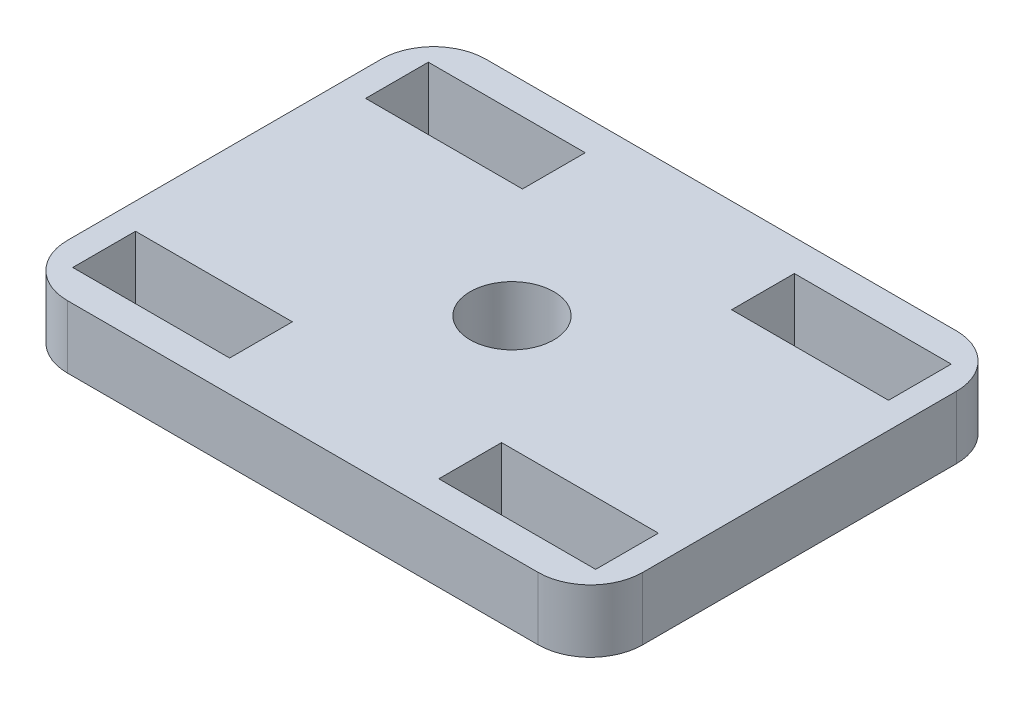
ISO-10303-21;
HEADER;
FILE_DESCRIPTION(('STEP AP214'),'2;1');
FILE_NAME('part.step','',(''),(''),'','','');
FILE_SCHEMA(('AUTOMOTIVE_DESIGN { 1 0 10303 214 1 1 1 1 }'));
ENDSEC;
DATA;
#1=APPLICATION_CONTEXT('core data for automotive mechanical design processes');
#2=APPLICATION_PROTOCOL_DEFINITION('international standard','automotive_design',2000,#1);
#3=PRODUCT_CONTEXT('',#1,'mechanical');
#4=PRODUCT('Part','Part','',(#3));
#5=PRODUCT_RELATED_PRODUCT_CATEGORY('part','',(#4));
#6=PRODUCT_DEFINITION_FORMATION('','',#4);
#7=PRODUCT_DEFINITION_CONTEXT('part definition',#1,'design');
#8=PRODUCT_DEFINITION('design','',#6,#7);
#9=PRODUCT_DEFINITION_SHAPE('','',#8);
#10=(LENGTH_UNIT() NAMED_UNIT(*) SI_UNIT(.MILLI.,.METRE.));
#11=(NAMED_UNIT(*) PLANE_ANGLE_UNIT() SI_UNIT($,.RADIAN.));
#12=(NAMED_UNIT(*) SI_UNIT($,.STERADIAN.) SOLID_ANGLE_UNIT());
#13=UNCERTAINTY_MEASURE_WITH_UNIT(LENGTH_MEASURE(1.E-05),#10,'distance_accuracy_value','');
#14=(GEOMETRIC_REPRESENTATION_CONTEXT(3) GLOBAL_UNCERTAINTY_ASSIGNED_CONTEXT((#13)) GLOBAL_UNIT_ASSIGNED_CONTEXT((#10,
#11,#12)) REPRESENTATION_CONTEXT('',''));
#15=CARTESIAN_POINT('',(0.,0.,0.));
#16=DIRECTION('',(0.,0.,1.));
#17=DIRECTION('',(1.,0.,0.));
#18=AXIS2_PLACEMENT_3D('',#15,#16,#17);
#19=CARTESIAN_POINT('',(27.5,3.,20.));
#20=DIRECTION('',(-1.,0.,0.));
#21=DIRECTION('',(0.,0.,1.));
#22=AXIS2_PLACEMENT_3D('',#19,#20,#21);
#23=PLANE('',#22);
#24=DIRECTION('',(0.,0.,-1.));
#25=VECTOR('',#24,1.);
#26=CARTESIAN_POINT('',(27.5,3.,20.));
#27=LINE('',#26,#25);
#28=CARTESIAN_POINT('',(27.5,3.,15.));
#29=VERTEX_POINT('',#28);
#30=CARTESIAN_POINT('',(27.5,3.,-15.));
#31=VERTEX_POINT('',#30);
#32=EDGE_CURVE('E338',#29,#31,#27,.T.);
#33=ORIENTED_EDGE('',*,*,#32,.F.);
#34=DIRECTION('',(0.,-1.,0.));
#35=VECTOR('',#34,1.);
#36=CARTESIAN_POINT('',(27.5,3.,15.));
#37=LINE('',#36,#35);
#38=CARTESIAN_POINT('',(27.5,-3.,15.));
#39=VERTEX_POINT('',#38);
#40=EDGE_CURVE('E360',#29,#39,#37,.T.);
#41=ORIENTED_EDGE('',*,*,#40,.T.);
#42=DIRECTION('',(0.,0.,-1.));
#43=VECTOR('',#42,1.);
#44=CARTESIAN_POINT('',(27.5,-3.,20.));
#45=LINE('',#44,#43);
#46=CARTESIAN_POINT('',(27.5,-3.,-15.));
#47=VERTEX_POINT('',#46);
#48=EDGE_CURVE('E331',#39,#47,#45,.T.);
#49=ORIENTED_EDGE('',*,*,#48,.T.);
#50=DIRECTION('',(0.,-1.,0.));
#51=VECTOR('',#50,1.);
#52=CARTESIAN_POINT('',(27.5,3.,-15.));
#53=LINE('',#52,#51);
#54=EDGE_CURVE('E349',#47,#31,#53,.F.);
#55=ORIENTED_EDGE('',*,*,#54,.T.);
#56=EDGE_LOOP('',(#33,#41,#49,#55));
#57=FACE_BOUND('',#56,.T.);
#58=ADVANCED_FACE('F32',(#57),#23,.F.);
#59=CARTESIAN_POINT('',(-27.5,3.,-20.));
#60=DIRECTION('',(0.,0.,1.));
#61=DIRECTION('',(1.,0.,0.));
#62=AXIS2_PLACEMENT_3D('',#59,#60,#61);
#63=PLANE('',#62);
#64=DIRECTION('',(-1.,0.,0.));
#65=VECTOR('',#64,1.);
#66=CARTESIAN_POINT('',(-27.5,3.,-20.));
#67=LINE('',#66,#65);
#68=CARTESIAN_POINT('',(22.5,3.,-20.));
#69=VERTEX_POINT('',#68);
#70=CARTESIAN_POINT('',(-22.5,3.,-20.));
#71=VERTEX_POINT('',#70);
#72=EDGE_CURVE('E341',#69,#71,#67,.T.);
#73=ORIENTED_EDGE('',*,*,#72,.F.);
#74=DIRECTION('',(0.,-1.,0.));
#75=VECTOR('',#74,1.);
#76=CARTESIAN_POINT('',(22.5,3.,-20.));
#77=LINE('',#76,#75);
#78=CARTESIAN_POINT('',(22.5,-3.,-20.));
#79=VERTEX_POINT('',#78);
#80=EDGE_CURVE('E385',#69,#79,#77,.T.);
#81=ORIENTED_EDGE('',*,*,#80,.T.);
#82=DIRECTION('',(-1.,0.,0.));
#83=VECTOR('',#82,1.);
#84=CARTESIAN_POINT('',(-27.5,-3.,-20.));
#85=LINE('',#84,#83);
#86=CARTESIAN_POINT('',(-22.5,-3.,-20.));
#87=VERTEX_POINT('',#86);
#88=EDGE_CURVE('E352',#79,#87,#85,.T.);
#89=ORIENTED_EDGE('',*,*,#88,.T.);
#90=DIRECTION('',(0.,-1.,0.));
#91=VECTOR('',#90,1.);
#92=CARTESIAN_POINT('',(-22.5,3.,-20.));
#93=LINE('',#92,#91);
#94=EDGE_CURVE('E383',#87,#71,#93,.F.);
#95=ORIENTED_EDGE('',*,*,#94,.T.);
#96=EDGE_LOOP('',(#73,#81,#89,#95));
#97=FACE_BOUND('',#96,.T.);
#98=ADVANCED_FACE('F391',(#97),#63,.F.);
#99=CARTESIAN_POINT('',(-27.5,3.,20.));
#100=DIRECTION('',(1.,0.,0.));
#101=DIRECTION('',(0.,0.,-1.));
#102=AXIS2_PLACEMENT_3D('',#99,#100,#101);
#103=PLANE('',#102);
#104=DIRECTION('',(0.,0.,1.));
#105=VECTOR('',#104,1.);
#106=CARTESIAN_POINT('',(-27.5,3.,20.));
#107=LINE('',#106,#105);
#108=CARTESIAN_POINT('',(-27.5,3.,-15.));
#109=VERTEX_POINT('',#108);
#110=CARTESIAN_POINT('',(-27.5,3.,15.));
#111=VERTEX_POINT('',#110);
#112=EDGE_CURVE('E344',#109,#111,#107,.T.);
#113=ORIENTED_EDGE('',*,*,#112,.F.);
#114=DIRECTION('',(0.,-1.,0.));
#115=VECTOR('',#114,1.);
#116=CARTESIAN_POINT('',(-27.5,3.,-15.));
#117=LINE('',#116,#115);
#118=CARTESIAN_POINT('',(-27.5,-3.,-15.));
#119=VERTEX_POINT('',#118);
#120=EDGE_CURVE('E11',#109,#119,#117,.T.);
#121=ORIENTED_EDGE('',*,*,#120,.T.);
#122=DIRECTION('',(0.,0.,1.));
#123=VECTOR('',#122,1.);
#124=CARTESIAN_POINT('',(-27.5,-3.,20.));
#125=LINE('',#124,#123);
#126=CARTESIAN_POINT('',(-27.5,-3.,15.));
#127=VERTEX_POINT('',#126);
#128=EDGE_CURVE('E355',#119,#127,#125,.T.);
#129=ORIENTED_EDGE('',*,*,#128,.T.);
#130=DIRECTION('',(0.,-1.,0.));
#131=VECTOR('',#130,1.);
#132=CARTESIAN_POINT('',(-27.5,3.,15.));
#133=LINE('',#132,#131);
#134=EDGE_CURVE('E40',#127,#111,#133,.F.);
#135=ORIENTED_EDGE('',*,*,#134,.T.);
#136=EDGE_LOOP('',(#113,#121,#129,#135));
#137=FACE_BOUND('',#136,.T.);
#138=ADVANCED_FACE('F402',(#137),#103,.F.);
#139=CARTESIAN_POINT('',(-27.5,3.,20.));
#140=DIRECTION('',(0.,0.,-1.));
#141=DIRECTION('',(-1.,0.,0.));
#142=AXIS2_PLACEMENT_3D('',#139,#140,#141);
#143=PLANE('',#142);
#144=DIRECTION('',(1.,0.,0.));
#145=VECTOR('',#144,1.);
#146=CARTESIAN_POINT('',(-27.5,-3.,20.));
#147=LINE('',#146,#145);
#148=CARTESIAN_POINT('',(-22.5,-3.,20.));
#149=VERTEX_POINT('',#148);
#150=CARTESIAN_POINT('',(22.5,-3.,20.));
#151=VERTEX_POINT('',#150);
#152=EDGE_CURVE('E342',#149,#151,#147,.T.);
#153=ORIENTED_EDGE('',*,*,#152,.T.);
#154=DIRECTION('',(0.,-1.,0.));
#155=VECTOR('',#154,1.);
#156=CARTESIAN_POINT('',(22.5,3.,20.));
#157=LINE('',#156,#155);
#158=CARTESIAN_POINT('',(22.5,3.,20.));
#159=VERTEX_POINT('',#158);
#160=EDGE_CURVE('E374',#151,#159,#157,.F.);
#161=ORIENTED_EDGE('',*,*,#160,.T.);
#162=DIRECTION('',(1.,0.,0.));
#163=VECTOR('',#162,1.);
#164=CARTESIAN_POINT('',(-27.5,3.,20.));
#165=LINE('',#164,#163);
#166=CARTESIAN_POINT('',(-22.5,3.,20.));
#167=VERTEX_POINT('',#166);
#168=EDGE_CURVE('E346',#167,#159,#165,.T.);
#169=ORIENTED_EDGE('',*,*,#168,.F.);
#170=DIRECTION('',(0.,-1.,0.));
#171=VECTOR('',#170,1.);
#172=CARTESIAN_POINT('',(-22.5,3.,20.));
#173=LINE('',#172,#171);
#174=EDGE_CURVE('E371',#167,#149,#173,.T.);
#175=ORIENTED_EDGE('',*,*,#174,.T.);
#176=EDGE_LOOP('',(#153,#161,#169,#175));
#177=FACE_BOUND('',#176,.T.);
#178=ADVANCED_FACE('F409',(#177),#143,.F.);
#179=CARTESIAN_POINT('',(0.,3.,0.));
#180=DIRECTION('',(0.,-1.,0.));
#181=DIRECTION('',(0.,0.,-1.));
#182=AXIS2_PLACEMENT_3D('',#179,#180,#181);
#183=PLANE('',#182);
#184=CARTESIAN_POINT('',(0.,3.,0.));
#185=DIRECTION('',(0.,-1.,0.));
#186=DIRECTION('',(0.,0.,-1.));
#187=AXIS2_PLACEMENT_3D('',#184,#185,#186);
#188=CIRCLE('',#187,4.);
#189=CARTESIAN_POINT('',(0.,3.,-4.));
#190=VERTEX_POINT('',#189);
#191=EDGE_CURVE('E232',#190,#190,#188,.T.);
#192=ORIENTED_EDGE('',*,*,#191,.T.);
#193=EDGE_LOOP('',(#192));
#194=FACE_BOUND('',#193,.T.);
#195=DIRECTION('',(-1.,0.,0.));
#196=VECTOR('',#195,1.);
#197=CARTESIAN_POINT('',(10.,3.,17.));
#198=LINE('',#197,#196);
#199=CARTESIAN_POINT('',(25.,3.,17.));
#200=VERTEX_POINT('',#199);
#201=CARTESIAN_POINT('',(10.,3.,17.));
#202=VERTEX_POINT('',#201);
#203=EDGE_CURVE('E252',#200,#202,#198,.T.);
#204=ORIENTED_EDGE('',*,*,#203,.T.);
#205=DIRECTION('',(0.,0.,-1.));
#206=VECTOR('',#205,1.);
#207=CARTESIAN_POINT('',(10.,3.,17.));
#208=LINE('',#207,#206);
#209=CARTESIAN_POINT('',(10.,3.,11.));
#210=VERTEX_POINT('',#209);
#211=EDGE_CURVE('E242',#202,#210,#208,.T.);
#212=ORIENTED_EDGE('',*,*,#211,.T.);
#213=DIRECTION('',(1.,0.,0.));
#214=VECTOR('',#213,1.);
#215=CARTESIAN_POINT('',(10.,3.,11.));
#216=LINE('',#215,#214);
#217=CARTESIAN_POINT('',(25.,3.,11.));
#218=VERTEX_POINT('',#217);
#219=EDGE_CURVE('E245',#210,#218,#216,.T.);
#220=ORIENTED_EDGE('',*,*,#219,.T.);
#221=DIRECTION('',(0.,0.,1.));
#222=VECTOR('',#221,1.);
#223=CARTESIAN_POINT('',(25.,3.,17.));
#224=LINE('',#223,#222);
#225=EDGE_CURVE('E249',#218,#200,#224,.T.);
#226=ORIENTED_EDGE('',*,*,#225,.T.);
#227=EDGE_LOOP('',(#204,#212,#220,#226));
#228=FACE_BOUND('',#227,.T.);
#229=DIRECTION('',(-1.,0.,0.));
#230=VECTOR('',#229,1.);
#231=CARTESIAN_POINT('',(-25.,3.,-11.));
#232=LINE('',#231,#230);
#233=CARTESIAN_POINT('',(-9.99999999999996,3.,-11.));
#234=VERTEX_POINT('',#233);
#235=CARTESIAN_POINT('',(-25.,3.,-11.));
#236=VERTEX_POINT('',#235);
#237=EDGE_CURVE('E286',#234,#236,#232,.T.);
#238=ORIENTED_EDGE('',*,*,#237,.T.);
#239=DIRECTION('',(0.,0.,-1.));
#240=VECTOR('',#239,1.);
#241=CARTESIAN_POINT('',(-25.,3.,-11.));
#242=LINE('',#241,#240);
#243=CARTESIAN_POINT('',(-25.,3.,-17.));
#244=VERTEX_POINT('',#243);
#245=EDGE_CURVE('E276',#236,#244,#242,.T.);
#246=ORIENTED_EDGE('',*,*,#245,.T.);
#247=DIRECTION('',(1.,0.,0.));
#248=VECTOR('',#247,1.);
#249=CARTESIAN_POINT('',(-25.,3.,-17.));
#250=LINE('',#249,#248);
#251=CARTESIAN_POINT('',(-9.99999999999996,3.,-17.));
#252=VERTEX_POINT('',#251);
#253=EDGE_CURVE('E279',#244,#252,#250,.T.);
#254=ORIENTED_EDGE('',*,*,#253,.T.);
#255=DIRECTION('',(0.,0.,1.));
#256=VECTOR('',#255,1.);
#257=CARTESIAN_POINT('',(-9.99999999999996,3.,-11.));
#258=LINE('',#257,#256);
#259=EDGE_CURVE('E283',#252,#234,#258,.T.);
#260=ORIENTED_EDGE('',*,*,#259,.T.);
#261=EDGE_LOOP('',(#238,#246,#254,#260));
#262=FACE_BOUND('',#261,.T.);
#263=DIRECTION('',(-1.,0.,0.));
#264=VECTOR('',#263,1.);
#265=CARTESIAN_POINT('',(10.,3.,-11.));
#266=LINE('',#265,#264);
#267=CARTESIAN_POINT('',(25.,3.,-11.));
#268=VERTEX_POINT('',#267);
#269=CARTESIAN_POINT('',(10.,3.,-11.));
#270=VERTEX_POINT('',#269);
#271=EDGE_CURVE('E206',#268,#270,#266,.T.);
#272=ORIENTED_EDGE('',*,*,#271,.T.);
#273=DIRECTION('',(0.,0.,-1.));
#274=VECTOR('',#273,1.);
#275=CARTESIAN_POINT('',(10.,3.,-11.));
#276=LINE('',#275,#274);
#277=CARTESIAN_POINT('',(10.,3.,-17.));
#278=VERTEX_POINT('',#277);
#279=EDGE_CURVE('E198',#270,#278,#276,.T.);
#280=ORIENTED_EDGE('',*,*,#279,.T.);
#281=DIRECTION('',(1.,0.,0.));
#282=VECTOR('',#281,1.);
#283=CARTESIAN_POINT('',(10.,3.,-17.));
#284=LINE('',#283,#282);
#285=CARTESIAN_POINT('',(25.,3.,-17.));
#286=VERTEX_POINT('',#285);
#287=EDGE_CURVE('E210',#278,#286,#284,.T.);
#288=ORIENTED_EDGE('',*,*,#287,.T.);
#289=DIRECTION('',(0.,0.,1.));
#290=VECTOR('',#289,1.);
#291=CARTESIAN_POINT('',(25.,3.,-11.));
#292=LINE('',#291,#290);
#293=EDGE_CURVE('E214',#286,#268,#292,.T.);
#294=ORIENTED_EDGE('',*,*,#293,.T.);
#295=EDGE_LOOP('',(#272,#280,#288,#294));
#296=FACE_BOUND('',#295,.T.);
#297=DIRECTION('',(-1.,0.,0.));
#298=VECTOR('',#297,1.);
#299=CARTESIAN_POINT('',(-25.,3.,17.));
#300=LINE('',#299,#298);
#301=CARTESIAN_POINT('',(-9.99999999999996,3.,17.));
#302=VERTEX_POINT('',#301);
#303=CARTESIAN_POINT('',(-25.,3.,17.));
#304=VERTEX_POINT('',#303);
#305=EDGE_CURVE('E316',#302,#304,#300,.T.);
#306=ORIENTED_EDGE('',*,*,#305,.T.);
#307=DIRECTION('',(0.,0.,-1.));
#308=VECTOR('',#307,1.);
#309=CARTESIAN_POINT('',(-25.,3.,17.));
#310=LINE('',#309,#308);
#311=CARTESIAN_POINT('',(-25.,3.,11.));
#312=VERTEX_POINT('',#311);
#313=EDGE_CURVE('E306',#304,#312,#310,.T.);
#314=ORIENTED_EDGE('',*,*,#313,.T.);
#315=DIRECTION('',(1.,0.,0.));
#316=VECTOR('',#315,1.);
#317=CARTESIAN_POINT('',(-25.,3.,11.));
#318=LINE('',#317,#316);
#319=CARTESIAN_POINT('',(-9.99999999999996,3.,11.));
#320=VERTEX_POINT('',#319);
#321=EDGE_CURVE('E309',#312,#320,#318,.T.);
#322=ORIENTED_EDGE('',*,*,#321,.T.);
#323=DIRECTION('',(0.,0.,1.));
#324=VECTOR('',#323,1.);
#325=CARTESIAN_POINT('',(-9.99999999999996,3.,17.));
#326=LINE('',#325,#324);
#327=EDGE_CURVE('E313',#320,#302,#326,.T.);
#328=ORIENTED_EDGE('',*,*,#327,.T.);
#329=EDGE_LOOP('',(#306,#314,#322,#328));
#330=FACE_BOUND('',#329,.T.);
#331=ORIENTED_EDGE('',*,*,#168,.T.);
#332=CARTESIAN_POINT('',(22.5,3.,15.));
#333=DIRECTION('',(0.,-1.,0.));
#334=DIRECTION('',(0.,0.,-1.));
#335=AXIS2_PLACEMENT_3D('',#332,#333,#334);
#336=CIRCLE('',#335,5.);
#337=EDGE_CURVE('E381',#159,#29,#336,.F.);
#338=ORIENTED_EDGE('',*,*,#337,.T.);
#339=ORIENTED_EDGE('',*,*,#32,.T.);
#340=CARTESIAN_POINT('',(22.5,3.,-15.));
#341=DIRECTION('',(0.,-1.,0.));
#342=DIRECTION('',(0.,0.,-1.));
#343=AXIS2_PLACEMENT_3D('',#340,#341,#342);
#344=CIRCLE('',#343,5.);
#345=EDGE_CURVE('E379',#31,#69,#344,.F.);
#346=ORIENTED_EDGE('',*,*,#345,.T.);
#347=ORIENTED_EDGE('',*,*,#72,.T.);
#348=CARTESIAN_POINT('',(-22.5,3.,-15.));
#349=DIRECTION('',(0.,-1.,0.));
#350=DIRECTION('',(0.,0.,-1.));
#351=AXIS2_PLACEMENT_3D('',#348,#349,#350);
#352=CIRCLE('',#351,5.);
#353=EDGE_CURVE('E53',#71,#109,#352,.F.);
#354=ORIENTED_EDGE('',*,*,#353,.T.);
#355=ORIENTED_EDGE('',*,*,#112,.T.);
#356=CARTESIAN_POINT('',(-22.5,3.,15.));
#357=DIRECTION('',(0.,-1.,0.));
#358=DIRECTION('',(0.,0.,-1.));
#359=AXIS2_PLACEMENT_3D('',#356,#357,#358);
#360=CIRCLE('',#359,5.);
#361=EDGE_CURVE('E376',#111,#167,#360,.F.);
#362=ORIENTED_EDGE('',*,*,#361,.T.);
#363=EDGE_LOOP('',(#331,#338,#339,#346,#347,#354,#355,#362));
#364=FACE_BOUND('',#363,.T.);
#365=ADVANCED_FACE('F216',(#194,#228,#262,#296,#330,#364),#183,.F.);
#366=CARTESIAN_POINT('',(0.,-3.,0.));
#367=DIRECTION('',(0.,-1.,0.));
#368=DIRECTION('',(0.,0.,-1.));
#369=AXIS2_PLACEMENT_3D('',#366,#367,#368);
#370=PLANE('',#369);
#371=CARTESIAN_POINT('',(0.,-3.,0.));
#372=DIRECTION('',(0.,-1.,0.));
#373=DIRECTION('',(0.,0.,-1.));
#374=AXIS2_PLACEMENT_3D('',#371,#372,#373);
#375=CIRCLE('',#374,4.);
#376=CARTESIAN_POINT('',(0.,-3.,-4.));
#377=VERTEX_POINT('',#376);
#378=EDGE_CURVE('E225',#377,#377,#375,.T.);
#379=ORIENTED_EDGE('',*,*,#378,.F.);
#380=EDGE_LOOP('',(#379));
#381=FACE_BOUND('',#380,.T.);
#382=DIRECTION('',(0.,0.,-1.));
#383=VECTOR('',#382,1.);
#384=CARTESIAN_POINT('',(10.,-3.,17.));
#385=LINE('',#384,#383);
#386=CARTESIAN_POINT('',(10.,-3.,17.));
#387=VERTEX_POINT('',#386);
#388=CARTESIAN_POINT('',(10.,-3.,11.));
#389=VERTEX_POINT('',#388);
#390=EDGE_CURVE('E256',#387,#389,#385,.T.);
#391=ORIENTED_EDGE('',*,*,#390,.F.);
#392=DIRECTION('',(-1.,0.,0.));
#393=VECTOR('',#392,1.);
#394=CARTESIAN_POINT('',(10.,-3.,17.));
#395=LINE('',#394,#393);
#396=CARTESIAN_POINT('',(25.,-3.,17.));
#397=VERTEX_POINT('',#396);
#398=EDGE_CURVE('E246',#397,#387,#395,.T.);
#399=ORIENTED_EDGE('',*,*,#398,.F.);
#400=DIRECTION('',(0.,0.,1.));
#401=VECTOR('',#400,1.);
#402=CARTESIAN_POINT('',(25.,-3.,17.));
#403=LINE('',#402,#401);
#404=CARTESIAN_POINT('',(25.,-3.,11.));
#405=VERTEX_POINT('',#404);
#406=EDGE_CURVE('E262',#405,#397,#403,.T.);
#407=ORIENTED_EDGE('',*,*,#406,.F.);
#408=DIRECTION('',(1.,0.,0.));
#409=VECTOR('',#408,1.);
#410=CARTESIAN_POINT('',(10.,-3.,11.));
#411=LINE('',#410,#409);
#412=EDGE_CURVE('E258',#389,#405,#411,.T.);
#413=ORIENTED_EDGE('',*,*,#412,.F.);
#414=EDGE_LOOP('',(#391,#399,#407,#413));
#415=FACE_BOUND('',#414,.T.);
#416=DIRECTION('',(0.,0.,-1.));
#417=VECTOR('',#416,1.);
#418=CARTESIAN_POINT('',(-25.,-3.,-11.));
#419=LINE('',#418,#417);
#420=CARTESIAN_POINT('',(-25.,-3.,-11.));
#421=VERTEX_POINT('',#420);
#422=CARTESIAN_POINT('',(-25.,-3.,-17.));
#423=VERTEX_POINT('',#422);
#424=EDGE_CURVE('E238',#421,#423,#419,.T.);
#425=ORIENTED_EDGE('',*,*,#424,.F.);
#426=DIRECTION('',(-1.,0.,0.));
#427=VECTOR('',#426,1.);
#428=CARTESIAN_POINT('',(-25.,-3.,-11.));
#429=LINE('',#428,#427);
#430=CARTESIAN_POINT('',(-9.99999999999996,-3.,-11.));
#431=VERTEX_POINT('',#430);
#432=EDGE_CURVE('E280',#431,#421,#429,.T.);
#433=ORIENTED_EDGE('',*,*,#432,.F.);
#434=DIRECTION('',(0.,0.,1.));
#435=VECTOR('',#434,1.);
#436=CARTESIAN_POINT('',(-9.99999999999996,-3.,-11.));
#437=LINE('',#436,#435);
#438=CARTESIAN_POINT('',(-9.99999999999996,-3.,-17.));
#439=VERTEX_POINT('',#438);
#440=EDGE_CURVE('E294',#439,#431,#437,.T.);
#441=ORIENTED_EDGE('',*,*,#440,.F.);
#442=DIRECTION('',(1.,0.,0.));
#443=VECTOR('',#442,1.);
#444=CARTESIAN_POINT('',(-25.,-3.,-17.));
#445=LINE('',#444,#443);
#446=EDGE_CURVE('E291',#423,#439,#445,.T.);
#447=ORIENTED_EDGE('',*,*,#446,.F.);
#448=EDGE_LOOP('',(#425,#433,#441,#447));
#449=FACE_BOUND('',#448,.T.);
#450=DIRECTION('',(0.,0.,-1.));
#451=VECTOR('',#450,1.);
#452=CARTESIAN_POINT('',(10.,-3.,-11.));
#453=LINE('',#452,#451);
#454=CARTESIAN_POINT('',(10.,-3.,-11.));
#455=VERTEX_POINT('',#454);
#456=CARTESIAN_POINT('',(10.,-3.,-17.));
#457=VERTEX_POINT('',#456);
#458=EDGE_CURVE('E201',#455,#457,#453,.T.);
#459=ORIENTED_EDGE('',*,*,#458,.F.);
#460=DIRECTION('',(-1.,0.,0.));
#461=VECTOR('',#460,1.);
#462=CARTESIAN_POINT('',(10.,-3.,-11.));
#463=LINE('',#462,#461);
#464=CARTESIAN_POINT('',(25.,-3.,-11.));
#465=VERTEX_POINT('',#464);
#466=EDGE_CURVE('E219',#465,#455,#463,.T.);
#467=ORIENTED_EDGE('',*,*,#466,.F.);
#468=DIRECTION('',(0.,0.,1.));
#469=VECTOR('',#468,1.);
#470=CARTESIAN_POINT('',(25.,-3.,-11.));
#471=LINE('',#470,#469);
#472=CARTESIAN_POINT('',(25.,-3.,-17.));
#473=VERTEX_POINT('',#472);
#474=EDGE_CURVE('E222',#473,#465,#471,.T.);
#475=ORIENTED_EDGE('',*,*,#474,.F.);
#476=DIRECTION('',(1.,0.,0.));
#477=VECTOR('',#476,1.);
#478=CARTESIAN_POINT('',(10.,-3.,-17.));
#479=LINE('',#478,#477);
#480=EDGE_CURVE('E231',#457,#473,#479,.T.);
#481=ORIENTED_EDGE('',*,*,#480,.F.);
#482=EDGE_LOOP('',(#459,#467,#475,#481));
#483=FACE_BOUND('',#482,.T.);
#484=DIRECTION('',(0.,0.,-1.));
#485=VECTOR('',#484,1.);
#486=CARTESIAN_POINT('',(-25.,-3.,17.));
#487=LINE('',#486,#485);
#488=CARTESIAN_POINT('',(-25.,-3.,17.));
#489=VERTEX_POINT('',#488);
#490=CARTESIAN_POINT('',(-25.,-3.,11.));
#491=VERTEX_POINT('',#490);
#492=EDGE_CURVE('E269',#489,#491,#487,.T.);
#493=ORIENTED_EDGE('',*,*,#492,.F.);
#494=DIRECTION('',(-1.,0.,0.));
#495=VECTOR('',#494,1.);
#496=CARTESIAN_POINT('',(-25.,-3.,17.));
#497=LINE('',#496,#495);
#498=CARTESIAN_POINT('',(-9.99999999999996,-3.,17.));
#499=VERTEX_POINT('',#498);
#500=EDGE_CURVE('E310',#499,#489,#497,.T.);
#501=ORIENTED_EDGE('',*,*,#500,.F.);
#502=DIRECTION('',(0.,0.,1.));
#503=VECTOR('',#502,1.);
#504=CARTESIAN_POINT('',(-9.99999999999996,-3.,17.));
#505=LINE('',#504,#503);
#506=CARTESIAN_POINT('',(-9.99999999999996,-3.,11.));
#507=VERTEX_POINT('',#506);
#508=EDGE_CURVE('E324',#507,#499,#505,.T.);
#509=ORIENTED_EDGE('',*,*,#508,.F.);
#510=DIRECTION('',(1.,0.,0.));
#511=VECTOR('',#510,1.);
#512=CARTESIAN_POINT('',(-25.,-3.,11.));
#513=LINE('',#512,#511);
#514=EDGE_CURVE('E321',#491,#507,#513,.T.);
#515=ORIENTED_EDGE('',*,*,#514,.F.);
#516=EDGE_LOOP('',(#493,#501,#509,#515));
#517=FACE_BOUND('',#516,.T.);
#518=ORIENTED_EDGE('',*,*,#48,.F.);
#519=CARTESIAN_POINT('',(22.5,-3.,15.));
#520=DIRECTION('',(0.,-1.,0.));
#521=DIRECTION('',(0.,0.,-1.));
#522=AXIS2_PLACEMENT_3D('',#519,#520,#521);
#523=CIRCLE('',#522,5.);
#524=EDGE_CURVE('E369',#39,#151,#523,.T.);
#525=ORIENTED_EDGE('',*,*,#524,.T.);
#526=ORIENTED_EDGE('',*,*,#152,.F.);
#527=CARTESIAN_POINT('',(-22.5,-3.,15.));
#528=DIRECTION('',(0.,-1.,0.));
#529=DIRECTION('',(0.,0.,-1.));
#530=AXIS2_PLACEMENT_3D('',#527,#528,#529);
#531=CIRCLE('',#530,5.);
#532=EDGE_CURVE('E363',#149,#127,#531,.T.);
#533=ORIENTED_EDGE('',*,*,#532,.T.);
#534=ORIENTED_EDGE('',*,*,#128,.F.);
#535=CARTESIAN_POINT('',(-22.5,-3.,-15.));
#536=DIRECTION('',(0.,-1.,0.));
#537=DIRECTION('',(0.,0.,-1.));
#538=AXIS2_PLACEMENT_3D('',#535,#536,#537);
#539=CIRCLE('',#538,5.);
#540=EDGE_CURVE('E365',#119,#87,#539,.T.);
#541=ORIENTED_EDGE('',*,*,#540,.T.);
#542=ORIENTED_EDGE('',*,*,#88,.F.);
#543=CARTESIAN_POINT('',(22.5,-3.,-15.));
#544=DIRECTION('',(0.,-1.,0.));
#545=DIRECTION('',(0.,0.,-1.));
#546=AXIS2_PLACEMENT_3D('',#543,#544,#545);
#547=CIRCLE('',#546,5.);
#548=EDGE_CURVE('E367',#79,#47,#547,.T.);
#549=ORIENTED_EDGE('',*,*,#548,.T.);
#550=EDGE_LOOP('',(#518,#525,#526,#533,#534,#541,#542,#549));
#551=FACE_BOUND('',#550,.T.);
#552=ADVANCED_FACE('F397',(#381,#415,#449,#483,#517,#551),#370,.T.);
#553=CARTESIAN_POINT('',(-25.,3.,17.));
#554=DIRECTION('',(-1.,0.,0.));
#555=DIRECTION('',(0.,0.,1.));
#556=AXIS2_PLACEMENT_3D('',#553,#554,#555);
#557=PLANE('',#556);
#558=ORIENTED_EDGE('',*,*,#492,.T.);
#559=DIRECTION('',(0.,-1.,0.));
#560=VECTOR('',#559,1.);
#561=CARTESIAN_POINT('',(-25.,3.,11.));
#562=LINE('',#561,#560);
#563=EDGE_CURVE('E319',#312,#491,#562,.T.);
#564=ORIENTED_EDGE('',*,*,#563,.F.);
#565=ORIENTED_EDGE('',*,*,#313,.F.);
#566=DIRECTION('',(0.,-1.,0.));
#567=VECTOR('',#566,1.);
#568=CARTESIAN_POINT('',(-25.,3.,17.));
#569=LINE('',#568,#567);
#570=EDGE_CURVE('E329',#304,#489,#569,.T.);
#571=ORIENTED_EDGE('',*,*,#570,.T.);
#572=EDGE_LOOP('',(#558,#564,#565,#571));
#573=FACE_BOUND('',#572,.T.);
#574=ADVANCED_FACE('F440',(#573),#557,.F.);
#575=CARTESIAN_POINT('',(-25.,3.,17.));
#576=DIRECTION('',(0.,0.,1.));
#577=DIRECTION('',(1.,0.,0.));
#578=AXIS2_PLACEMENT_3D('',#575,#576,#577);
#579=PLANE('',#578);
#580=ORIENTED_EDGE('',*,*,#500,.T.);
#581=ORIENTED_EDGE('',*,*,#570,.F.);
#582=ORIENTED_EDGE('',*,*,#305,.F.);
#583=DIRECTION('',(0.,-1.,0.));
#584=VECTOR('',#583,1.);
#585=CARTESIAN_POINT('',(-9.99999999999996,3.,17.));
#586=LINE('',#585,#584);
#587=EDGE_CURVE('E332',#302,#499,#586,.T.);
#588=ORIENTED_EDGE('',*,*,#587,.T.);
#589=EDGE_LOOP('',(#580,#581,#582,#588));
#590=FACE_BOUND('',#589,.T.);
#591=ADVANCED_FACE('F447',(#590),#579,.F.);
#592=CARTESIAN_POINT('',(-9.99999999999996,3.,17.));
#593=DIRECTION('',(1.,0.,0.));
#594=DIRECTION('',(0.,0.,-1.));
#595=AXIS2_PLACEMENT_3D('',#592,#593,#594);
#596=PLANE('',#595);
#597=ORIENTED_EDGE('',*,*,#508,.T.);
#598=ORIENTED_EDGE('',*,*,#587,.F.);
#599=ORIENTED_EDGE('',*,*,#327,.F.);
#600=DIRECTION('',(0.,-1.,0.));
#601=VECTOR('',#600,1.);
#602=CARTESIAN_POINT('',(-9.99999999999996,3.,11.));
#603=LINE('',#602,#601);
#604=EDGE_CURVE('E334',#320,#507,#603,.T.);
#605=ORIENTED_EDGE('',*,*,#604,.T.);
#606=EDGE_LOOP('',(#597,#598,#599,#605));
#607=FACE_BOUND('',#606,.T.);
#608=ADVANCED_FACE('F452',(#607),#596,.F.);
#609=CARTESIAN_POINT('',(-25.,3.,11.));
#610=DIRECTION('',(0.,0.,-1.));
#611=DIRECTION('',(-1.,0.,0.));
#612=AXIS2_PLACEMENT_3D('',#609,#610,#611);
#613=PLANE('',#612);
#614=ORIENTED_EDGE('',*,*,#514,.T.);
#615=ORIENTED_EDGE('',*,*,#604,.F.);
#616=ORIENTED_EDGE('',*,*,#321,.F.);
#617=ORIENTED_EDGE('',*,*,#563,.T.);
#618=EDGE_LOOP('',(#614,#615,#616,#617));
#619=FACE_BOUND('',#618,.T.);
#620=ADVANCED_FACE('F449',(#619),#613,.F.);
#621=CARTESIAN_POINT('',(10.,3.,-11.));
#622=DIRECTION('',(-1.,0.,0.));
#623=DIRECTION('',(0.,0.,1.));
#624=AXIS2_PLACEMENT_3D('',#621,#622,#623);
#625=PLANE('',#624);
#626=ORIENTED_EDGE('',*,*,#458,.T.);
#627=DIRECTION('',(0.,-1.,0.));
#628=VECTOR('',#627,1.);
#629=CARTESIAN_POINT('',(10.,3.,-17.));
#630=LINE('',#629,#628);
#631=EDGE_CURVE('E194',#278,#457,#630,.T.);
#632=ORIENTED_EDGE('',*,*,#631,.F.);
#633=ORIENTED_EDGE('',*,*,#279,.F.);
#634=DIRECTION('',(0.,-1.,0.));
#635=VECTOR('',#634,1.);
#636=CARTESIAN_POINT('',(10.,3.,-11.));
#637=LINE('',#636,#635);
#638=EDGE_CURVE('E236',#270,#455,#637,.T.);
#639=ORIENTED_EDGE('',*,*,#638,.T.);
#640=EDGE_LOOP('',(#626,#632,#633,#639));
#641=FACE_BOUND('',#640,.T.);
#642=ADVANCED_FACE('F196',(#641),#625,.F.);
#643=CARTESIAN_POINT('',(10.,3.,-11.));
#644=DIRECTION('',(0.,0.,1.));
#645=DIRECTION('',(1.,0.,0.));
#646=AXIS2_PLACEMENT_3D('',#643,#644,#645);
#647=PLANE('',#646);
#648=ORIENTED_EDGE('',*,*,#466,.T.);
#649=ORIENTED_EDGE('',*,*,#638,.F.);
#650=ORIENTED_EDGE('',*,*,#271,.F.);
#651=DIRECTION('',(0.,-1.,0.));
#652=VECTOR('',#651,1.);
#653=CARTESIAN_POINT('',(25.,3.,-11.));
#654=LINE('',#653,#652);
#655=EDGE_CURVE('E239',#268,#465,#654,.T.);
#656=ORIENTED_EDGE('',*,*,#655,.T.);
#657=EDGE_LOOP('',(#648,#649,#650,#656));
#658=FACE_BOUND('',#657,.T.);
#659=ADVANCED_FACE('F494',(#658),#647,.F.);
#660=CARTESIAN_POINT('',(25.,3.,-11.));
#661=DIRECTION('',(1.,0.,0.));
#662=DIRECTION('',(0.,0.,-1.));
#663=AXIS2_PLACEMENT_3D('',#660,#661,#662);
#664=PLANE('',#663);
#665=ORIENTED_EDGE('',*,*,#474,.T.);
#666=ORIENTED_EDGE('',*,*,#655,.F.);
#667=ORIENTED_EDGE('',*,*,#293,.F.);
#668=DIRECTION('',(0.,-1.,0.));
#669=VECTOR('',#668,1.);
#670=CARTESIAN_POINT('',(25.,3.,-17.));
#671=LINE('',#670,#669);
#672=EDGE_CURVE('E205',#286,#473,#671,.T.);
#673=ORIENTED_EDGE('',*,*,#672,.T.);
#674=EDGE_LOOP('',(#665,#666,#667,#673));
#675=FACE_BOUND('',#674,.T.);
#676=ADVANCED_FACE('F497',(#675),#664,.F.);
#677=CARTESIAN_POINT('',(10.,3.,-17.));
#678=DIRECTION('',(0.,0.,-1.));
#679=DIRECTION('',(-1.,0.,0.));
#680=AXIS2_PLACEMENT_3D('',#677,#678,#679);
#681=PLANE('',#680);
#682=ORIENTED_EDGE('',*,*,#480,.T.);
#683=ORIENTED_EDGE('',*,*,#672,.F.);
#684=ORIENTED_EDGE('',*,*,#287,.F.);
#685=ORIENTED_EDGE('',*,*,#631,.T.);
#686=EDGE_LOOP('',(#682,#683,#684,#685));
#687=FACE_BOUND('',#686,.T.);
#688=ADVANCED_FACE('F211',(#687),#681,.F.);
#689=CARTESIAN_POINT('',(-25.,3.,-11.));
#690=DIRECTION('',(-1.,0.,0.));
#691=DIRECTION('',(0.,0.,1.));
#692=AXIS2_PLACEMENT_3D('',#689,#690,#691);
#693=PLANE('',#692);
#694=ORIENTED_EDGE('',*,*,#424,.T.);
#695=DIRECTION('',(0.,-1.,0.));
#696=VECTOR('',#695,1.);
#697=CARTESIAN_POINT('',(-25.,3.,-17.));
#698=LINE('',#697,#696);
#699=EDGE_CURVE('E289',#244,#423,#698,.T.);
#700=ORIENTED_EDGE('',*,*,#699,.F.);
#701=ORIENTED_EDGE('',*,*,#245,.F.);
#702=DIRECTION('',(0.,-1.,0.));
#703=VECTOR('',#702,1.);
#704=CARTESIAN_POINT('',(-25.,3.,-11.));
#705=LINE('',#704,#703);
#706=EDGE_CURVE('E259',#236,#421,#705,.T.);
#707=ORIENTED_EDGE('',*,*,#706,.T.);
#708=EDGE_LOOP('',(#694,#700,#701,#707));
#709=FACE_BOUND('',#708,.T.);
#710=ADVANCED_FACE('F460',(#709),#693,.F.);
#711=CARTESIAN_POINT('',(-25.,3.,-11.));
#712=DIRECTION('',(0.,0.,1.));
#713=DIRECTION('',(1.,0.,0.));
#714=AXIS2_PLACEMENT_3D('',#711,#712,#713);
#715=PLANE('',#714);
#716=ORIENTED_EDGE('',*,*,#432,.T.);
#717=ORIENTED_EDGE('',*,*,#706,.F.);
#718=ORIENTED_EDGE('',*,*,#237,.F.);
#719=DIRECTION('',(0.,-1.,0.));
#720=VECTOR('',#719,1.);
#721=CARTESIAN_POINT('',(-9.99999999999996,3.,-11.));
#722=LINE('',#721,#720);
#723=EDGE_CURVE('E300',#234,#431,#722,.T.);
#724=ORIENTED_EDGE('',*,*,#723,.T.);
#725=EDGE_LOOP('',(#716,#717,#718,#724));
#726=FACE_BOUND('',#725,.T.);
#727=ADVANCED_FACE('F463',(#726),#715,.F.);
#728=CARTESIAN_POINT('',(-9.99999999999996,3.,-11.));
#729=DIRECTION('',(1.,0.,0.));
#730=DIRECTION('',(0.,0.,-1.));
#731=AXIS2_PLACEMENT_3D('',#728,#729,#730);
#732=PLANE('',#731);
#733=ORIENTED_EDGE('',*,*,#440,.T.);
#734=ORIENTED_EDGE('',*,*,#723,.F.);
#735=ORIENTED_EDGE('',*,*,#259,.F.);
#736=DIRECTION('',(0.,-1.,0.));
#737=VECTOR('',#736,1.);
#738=CARTESIAN_POINT('',(-9.99999999999996,3.,-17.));
#739=LINE('',#738,#737);
#740=EDGE_CURVE('E302',#252,#439,#739,.T.);
#741=ORIENTED_EDGE('',*,*,#740,.T.);
#742=EDGE_LOOP('',(#733,#734,#735,#741));
#743=FACE_BOUND('',#742,.T.);
#744=ADVANCED_FACE('F469',(#743),#732,.F.);
#745=CARTESIAN_POINT('',(-25.,3.,-17.));
#746=DIRECTION('',(0.,0.,-1.));
#747=DIRECTION('',(-1.,0.,0.));
#748=AXIS2_PLACEMENT_3D('',#745,#746,#747);
#749=PLANE('',#748);
#750=ORIENTED_EDGE('',*,*,#446,.T.);
#751=ORIENTED_EDGE('',*,*,#740,.F.);
#752=ORIENTED_EDGE('',*,*,#253,.F.);
#753=ORIENTED_EDGE('',*,*,#699,.T.);
#754=EDGE_LOOP('',(#750,#751,#752,#753));
#755=FACE_BOUND('',#754,.T.);
#756=ADVANCED_FACE('F465',(#755),#749,.F.);
#757=CARTESIAN_POINT('',(10.,3.,17.));
#758=DIRECTION('',(-1.,0.,0.));
#759=DIRECTION('',(0.,0.,1.));
#760=AXIS2_PLACEMENT_3D('',#757,#758,#759);
#761=PLANE('',#760);
#762=ORIENTED_EDGE('',*,*,#390,.T.);
#763=DIRECTION('',(0.,-1.,0.));
#764=VECTOR('',#763,1.);
#765=CARTESIAN_POINT('',(10.,3.,11.));
#766=LINE('',#765,#764);
#767=EDGE_CURVE('E255',#210,#389,#766,.T.);
#768=ORIENTED_EDGE('',*,*,#767,.F.);
#769=ORIENTED_EDGE('',*,*,#211,.F.);
#770=DIRECTION('',(0.,-1.,0.));
#771=VECTOR('',#770,1.);
#772=CARTESIAN_POINT('',(10.,3.,17.));
#773=LINE('',#772,#771);
#774=EDGE_CURVE('E267',#202,#387,#773,.T.);
#775=ORIENTED_EDGE('',*,*,#774,.T.);
#776=EDGE_LOOP('',(#762,#768,#769,#775));
#777=FACE_BOUND('',#776,.T.);
#778=ADVANCED_FACE('F468',(#777),#761,.F.);
#779=CARTESIAN_POINT('',(10.,3.,17.));
#780=DIRECTION('',(0.,0.,1.));
#781=DIRECTION('',(1.,0.,0.));
#782=AXIS2_PLACEMENT_3D('',#779,#780,#781);
#783=PLANE('',#782);
#784=ORIENTED_EDGE('',*,*,#398,.T.);
#785=ORIENTED_EDGE('',*,*,#774,.F.);
#786=ORIENTED_EDGE('',*,*,#203,.F.);
#787=DIRECTION('',(0.,-1.,0.));
#788=VECTOR('',#787,1.);
#789=CARTESIAN_POINT('',(25.,3.,17.));
#790=LINE('',#789,#788);
#791=EDGE_CURVE('E270',#200,#397,#790,.T.);
#792=ORIENTED_EDGE('',*,*,#791,.T.);
#793=EDGE_LOOP('',(#784,#785,#786,#792));
#794=FACE_BOUND('',#793,.T.);
#795=ADVANCED_FACE('F479',(#794),#783,.F.);
#796=CARTESIAN_POINT('',(25.,3.,17.));
#797=DIRECTION('',(1.,0.,0.));
#798=DIRECTION('',(0.,0.,-1.));
#799=AXIS2_PLACEMENT_3D('',#796,#797,#798);
#800=PLANE('',#799);
#801=ORIENTED_EDGE('',*,*,#406,.T.);
#802=ORIENTED_EDGE('',*,*,#791,.F.);
#803=ORIENTED_EDGE('',*,*,#225,.F.);
#804=DIRECTION('',(0.,-1.,0.));
#805=VECTOR('',#804,1.);
#806=CARTESIAN_POINT('',(25.,3.,11.));
#807=LINE('',#806,#805);
#808=EDGE_CURVE('E272',#218,#405,#807,.T.);
#809=ORIENTED_EDGE('',*,*,#808,.T.);
#810=EDGE_LOOP('',(#801,#802,#803,#809));
#811=FACE_BOUND('',#810,.T.);
#812=ADVANCED_FACE('F484',(#811),#800,.F.);
#813=CARTESIAN_POINT('',(10.,3.,11.));
#814=DIRECTION('',(0.,0.,-1.));
#815=DIRECTION('',(-1.,0.,0.));
#816=AXIS2_PLACEMENT_3D('',#813,#814,#815);
#817=PLANE('',#816);
#818=ORIENTED_EDGE('',*,*,#412,.T.);
#819=ORIENTED_EDGE('',*,*,#808,.F.);
#820=ORIENTED_EDGE('',*,*,#219,.F.);
#821=ORIENTED_EDGE('',*,*,#767,.T.);
#822=EDGE_LOOP('',(#818,#819,#820,#821));
#823=FACE_BOUND('',#822,.T.);
#824=ADVANCED_FACE('F481',(#823),#817,.F.);
#825=CARTESIAN_POINT('',(0.,3.,0.));
#826=DIRECTION('',(0.,-1.,0.));
#827=DIRECTION('',(0.,0.,-1.));
#828=AXIS2_PLACEMENT_3D('',#825,#826,#827);
#829=CYLINDRICAL_SURFACE('',#828,4.);
#830=ORIENTED_EDGE('',*,*,#191,.F.);
#831=EDGE_LOOP('',(#830));
#832=FACE_BOUND('',#831,.T.);
#833=ORIENTED_EDGE('',*,*,#378,.T.);
#834=EDGE_LOOP('',(#833));
#835=FACE_BOUND('',#834,.T.);
#836=ADVANCED_FACE('F425',(#832,#835),#829,.F.);
#837=CARTESIAN_POINT('',(22.5,3.,15.));
#838=DIRECTION('',(0.,-1.,0.));
#839=DIRECTION('',(0.,0.,-1.));
#840=AXIS2_PLACEMENT_3D('',#837,#838,#839);
#841=CYLINDRICAL_SURFACE('',#840,5.);
#842=ORIENTED_EDGE('',*,*,#337,.F.);
#843=ORIENTED_EDGE('',*,*,#160,.F.);
#844=ORIENTED_EDGE('',*,*,#524,.F.);
#845=ORIENTED_EDGE('',*,*,#40,.F.);
#846=EDGE_LOOP('',(#842,#843,#844,#845));
#847=FACE_BOUND('',#846,.T.);
#848=ADVANCED_FACE('F414',(#847),#841,.T.);
#849=CARTESIAN_POINT('',(22.5,3.,-15.));
#850=DIRECTION('',(0.,-1.,0.));
#851=DIRECTION('',(0.,0.,-1.));
#852=AXIS2_PLACEMENT_3D('',#849,#850,#851);
#853=CYLINDRICAL_SURFACE('',#852,5.);
#854=ORIENTED_EDGE('',*,*,#345,.F.);
#855=ORIENTED_EDGE('',*,*,#54,.F.);
#856=ORIENTED_EDGE('',*,*,#548,.F.);
#857=ORIENTED_EDGE('',*,*,#80,.F.);
#858=EDGE_LOOP('',(#854,#855,#856,#857));
#859=FACE_BOUND('',#858,.T.);
#860=ADVANCED_FACE('F418',(#859),#853,.T.);
#861=CARTESIAN_POINT('',(-22.5,3.,-15.));
#862=DIRECTION('',(0.,-1.,0.));
#863=DIRECTION('',(0.,0.,-1.));
#864=AXIS2_PLACEMENT_3D('',#861,#862,#863);
#865=CYLINDRICAL_SURFACE('',#864,5.);
#866=ORIENTED_EDGE('',*,*,#353,.F.);
#867=ORIENTED_EDGE('',*,*,#94,.F.);
#868=ORIENTED_EDGE('',*,*,#540,.F.);
#869=ORIENTED_EDGE('',*,*,#120,.F.);
#870=EDGE_LOOP('',(#866,#867,#868,#869));
#871=FACE_BOUND('',#870,.T.);
#872=ADVANCED_FACE('F401',(#871),#865,.T.);
#873=CARTESIAN_POINT('',(-22.5,3.,15.));
#874=DIRECTION('',(0.,-1.,0.));
#875=DIRECTION('',(0.,0.,-1.));
#876=AXIS2_PLACEMENT_3D('',#873,#874,#875);
#877=CYLINDRICAL_SURFACE('',#876,5.);
#878=ORIENTED_EDGE('',*,*,#361,.F.);
#879=ORIENTED_EDGE('',*,*,#134,.F.);
#880=ORIENTED_EDGE('',*,*,#532,.F.);
#881=ORIENTED_EDGE('',*,*,#174,.F.);
#882=EDGE_LOOP('',(#878,#879,#880,#881));
#883=FACE_BOUND('',#882,.T.);
#884=ADVANCED_FACE('F34',(#883),#877,.T.);
#885=CLOSED_SHELL('',(#58,#98,#138,#178,#365,#552,#574,#591,#608,#620,#642,#659,#676,#688,#710,
#727,#744,#756,#778,#795,#812,#824,#836,#848,#860,#872,#884));
#886=MANIFOLD_SOLID_BREP('B2',#885);
#887=ADVANCED_BREP_SHAPE_REPRESENTATION('',(#18,#886),#14);
#888=SHAPE_DEFINITION_REPRESENTATION(#9,#887);
ENDSEC;
END-ISO-10303-21;
